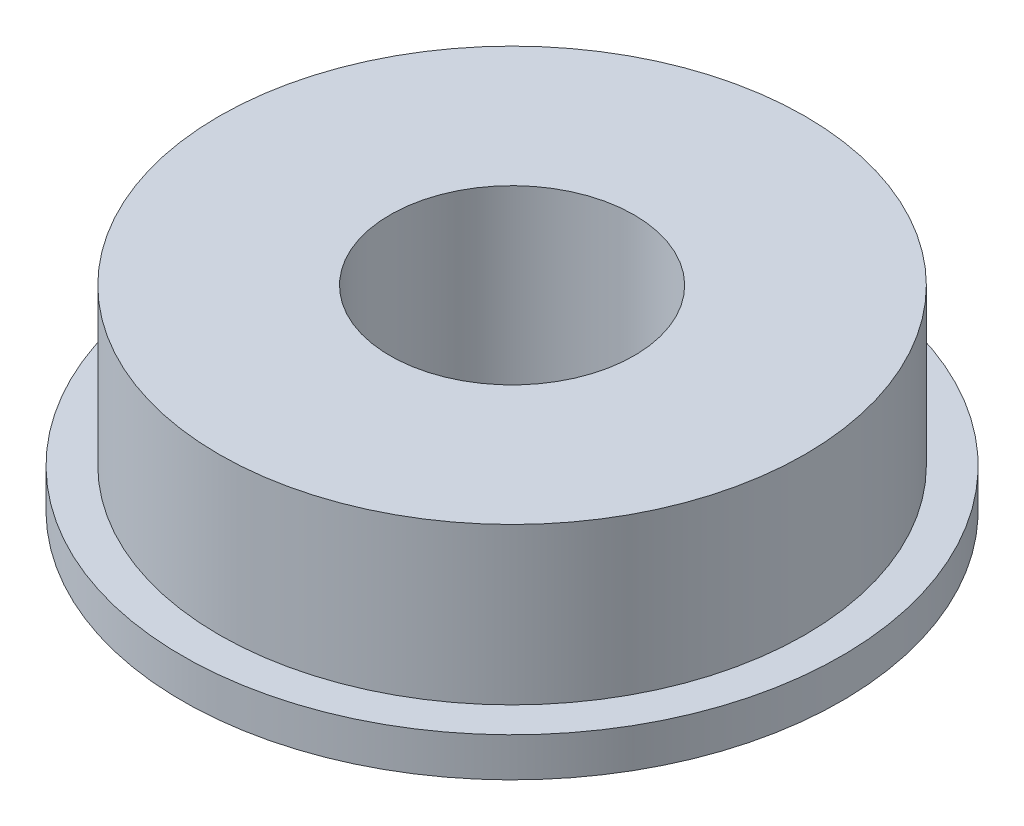
ISO-10303-21;
HEADER;
FILE_DESCRIPTION(('STEP AP214'),'2;1');
FILE_NAME('part.step','',(''),(''),'','','');
FILE_SCHEMA(('AUTOMOTIVE_DESIGN { 1 0 10303 214 1 1 1 1 }'));
ENDSEC;
DATA;
#1=APPLICATION_CONTEXT('core data for automotive mechanical design processes');
#2=APPLICATION_PROTOCOL_DEFINITION('international standard','automotive_design',2000,#1);
#3=PRODUCT_CONTEXT('',#1,'mechanical');
#4=PRODUCT('Part','Part','',(#3));
#5=PRODUCT_RELATED_PRODUCT_CATEGORY('part','',(#4));
#6=PRODUCT_DEFINITION_FORMATION('','',#4);
#7=PRODUCT_DEFINITION_CONTEXT('part definition',#1,'design');
#8=PRODUCT_DEFINITION('design','',#6,#7);
#9=PRODUCT_DEFINITION_SHAPE('','',#8);
#10=(LENGTH_UNIT() NAMED_UNIT(*) SI_UNIT(.MILLI.,.METRE.));
#11=(NAMED_UNIT(*) PLANE_ANGLE_UNIT() SI_UNIT($,.RADIAN.));
#12=(NAMED_UNIT(*) SI_UNIT($,.STERADIAN.) SOLID_ANGLE_UNIT());
#13=UNCERTAINTY_MEASURE_WITH_UNIT(LENGTH_MEASURE(1.E-05),#10,'distance_accuracy_value','');
#14=(GEOMETRIC_REPRESENTATION_CONTEXT(3) GLOBAL_UNCERTAINTY_ASSIGNED_CONTEXT((#13)) GLOBAL_UNIT_ASSIGNED_CONTEXT((#10,
#11,#12)) REPRESENTATION_CONTEXT('',''));
#15=CARTESIAN_POINT('',(0.,0.,0.));
#16=DIRECTION('',(0.,0.,1.));
#17=DIRECTION('',(1.,0.,0.));
#18=AXIS2_PLACEMENT_3D('',#15,#16,#17);
#19=CARTESIAN_POINT('',(6.75,0.,0.));
#20=DIRECTION('',(0.,-1.,0.));
#21=DIRECTION('',(0.,0.,-1.));
#22=AXIS2_PLACEMENT_3D('',#19,#20,#21);
#23=PLANE('',#22);
#24=CARTESIAN_POINT('',(0.,0.,0.));
#25=DIRECTION('',(0.,-1.,0.));
#26=DIRECTION('',(0.,0.,-1.));
#27=AXIS2_PLACEMENT_3D('',#24,#25,#26);
#28=CIRCLE('',#27,6.75);
#29=CARTESIAN_POINT('',(0.,0.,-6.75));
#30=VERTEX_POINT('',#29);
#31=EDGE_CURVE('E56',#30,#30,#28,.T.);
#32=ORIENTED_EDGE('',*,*,#31,.T.);
#33=EDGE_LOOP('',(#32));
#34=FACE_BOUND('',#33,.T.);
#35=CARTESIAN_POINT('',(0.,0.,0.));
#36=DIRECTION('',(0.,-1.,0.));
#37=DIRECTION('',(0.,0.,-1.));
#38=AXIS2_PLACEMENT_3D('',#35,#36,#37);
#39=CIRCLE('',#38,2.5);
#40=CARTESIAN_POINT('',(0.,0.,-2.5));
#41=VERTEX_POINT('',#40);
#42=EDGE_CURVE('E10',#41,#41,#39,.T.);
#43=ORIENTED_EDGE('',*,*,#42,.F.);
#44=EDGE_LOOP('',(#43));
#45=FACE_BOUND('',#44,.T.);
#46=ADVANCED_FACE('F34',(#34,#45),#23,.T.);
#47=CARTESIAN_POINT('',(0.,0.,0.));
#48=DIRECTION('',(0.,-1.,0.));
#49=DIRECTION('',(0.,0.,-1.));
#50=AXIS2_PLACEMENT_3D('',#47,#48,#49);
#51=CYLINDRICAL_SURFACE('',#50,2.5);
#52=ORIENTED_EDGE('',*,*,#42,.T.);
#53=EDGE_LOOP('',(#52));
#54=FACE_BOUND('',#53,.T.);
#55=CARTESIAN_POINT('',(0.,4.,0.));
#56=DIRECTION('',(0.,-1.,0.));
#57=DIRECTION('',(0.,0.,-1.));
#58=AXIS2_PLACEMENT_3D('',#55,#56,#57);
#59=CIRCLE('',#58,2.5);
#60=CARTESIAN_POINT('',(0.,4.,-2.5));
#61=VERTEX_POINT('',#60);
#62=EDGE_CURVE('E40',#61,#61,#59,.T.);
#63=ORIENTED_EDGE('',*,*,#62,.F.);
#64=EDGE_LOOP('',(#63));
#65=FACE_BOUND('',#64,.T.);
#66=ADVANCED_FACE('F74',(#54,#65),#51,.F.);
#67=CARTESIAN_POINT('',(2.5,4.,0.));
#68=DIRECTION('',(0.,1.,0.));
#69=DIRECTION('',(0.,0.,1.));
#70=AXIS2_PLACEMENT_3D('',#67,#68,#69);
#71=PLANE('',#70);
#72=ORIENTED_EDGE('',*,*,#62,.T.);
#73=EDGE_LOOP('',(#72));
#74=FACE_BOUND('',#73,.T.);
#75=CARTESIAN_POINT('',(0.,4.,0.));
#76=DIRECTION('',(0.,-1.,0.));
#77=DIRECTION('',(0.,0.,-1.));
#78=AXIS2_PLACEMENT_3D('',#75,#76,#77);
#79=CIRCLE('',#78,6.);
#80=CARTESIAN_POINT('',(0.,4.,-6.));
#81=VERTEX_POINT('',#80);
#82=EDGE_CURVE('E44',#81,#81,#79,.T.);
#83=ORIENTED_EDGE('',*,*,#82,.F.);
#84=EDGE_LOOP('',(#83));
#85=FACE_BOUND('',#84,.T.);
#86=ADVANCED_FACE('F78',(#74,#85),#71,.T.);
#87=CARTESIAN_POINT('',(0.,0.,0.));
#88=DIRECTION('',(0.,-1.,0.));
#89=DIRECTION('',(0.,0.,-1.));
#90=AXIS2_PLACEMENT_3D('',#87,#88,#89);
#91=CYLINDRICAL_SURFACE('',#90,6.);
#92=ORIENTED_EDGE('',*,*,#82,.T.);
#93=EDGE_LOOP('',(#92));
#94=FACE_BOUND('',#93,.T.);
#95=CARTESIAN_POINT('',(0.,0.8,0.));
#96=DIRECTION('',(0.,-1.,0.));
#97=DIRECTION('',(0.,0.,-1.));
#98=AXIS2_PLACEMENT_3D('',#95,#96,#97);
#99=CIRCLE('',#98,6.);
#100=CARTESIAN_POINT('',(0.,0.8,-6.));
#101=VERTEX_POINT('',#100);
#102=EDGE_CURVE('E48',#101,#101,#99,.T.);
#103=ORIENTED_EDGE('',*,*,#102,.F.);
#104=EDGE_LOOP('',(#103));
#105=FACE_BOUND('',#104,.T.);
#106=ADVANCED_FACE('F70',(#94,#105),#91,.T.);
#107=CARTESIAN_POINT('',(6.,0.8,0.));
#108=DIRECTION('',(0.,1.,0.));
#109=DIRECTION('',(0.,0.,1.));
#110=AXIS2_PLACEMENT_3D('',#107,#108,#109);
#111=PLANE('',#110);
#112=ORIENTED_EDGE('',*,*,#102,.T.);
#113=EDGE_LOOP('',(#112));
#114=FACE_BOUND('',#113,.T.);
#115=CARTESIAN_POINT('',(0.,0.8,0.));
#116=DIRECTION('',(0.,-1.,0.));
#117=DIRECTION('',(0.,0.,-1.));
#118=AXIS2_PLACEMENT_3D('',#115,#116,#117);
#119=CIRCLE('',#118,6.75);
#120=CARTESIAN_POINT('',(0.,0.8,-6.75));
#121=VERTEX_POINT('',#120);
#122=EDGE_CURVE('E53',#121,#121,#119,.T.);
#123=ORIENTED_EDGE('',*,*,#122,.F.);
#124=EDGE_LOOP('',(#123));
#125=FACE_BOUND('',#124,.T.);
#126=ADVANCED_FACE('F64',(#114,#125),#111,.T.);
#127=CARTESIAN_POINT('',(0.,0.,0.));
#128=DIRECTION('',(0.,-1.,0.));
#129=DIRECTION('',(0.,0.,-1.));
#130=AXIS2_PLACEMENT_3D('',#127,#128,#129);
#131=CYLINDRICAL_SURFACE('',#130,6.75);
#132=ORIENTED_EDGE('',*,*,#122,.T.);
#133=EDGE_LOOP('',(#132));
#134=FACE_BOUND('',#133,.T.);
#135=ORIENTED_EDGE('',*,*,#31,.F.);
#136=EDGE_LOOP('',(#135));
#137=FACE_BOUND('',#136,.T.);
#138=ADVANCED_FACE('F62',(#134,#137),#131,.T.);
#139=CLOSED_SHELL('',(#46,#66,#86,#106,#126,#138));
#140=MANIFOLD_SOLID_BREP('B2',#139);
#141=ADVANCED_BREP_SHAPE_REPRESENTATION('',(#18,#140),#14);
#142=SHAPE_DEFINITION_REPRESENTATION(#9,#141);
ENDSEC;
END-ISO-10303-21;
